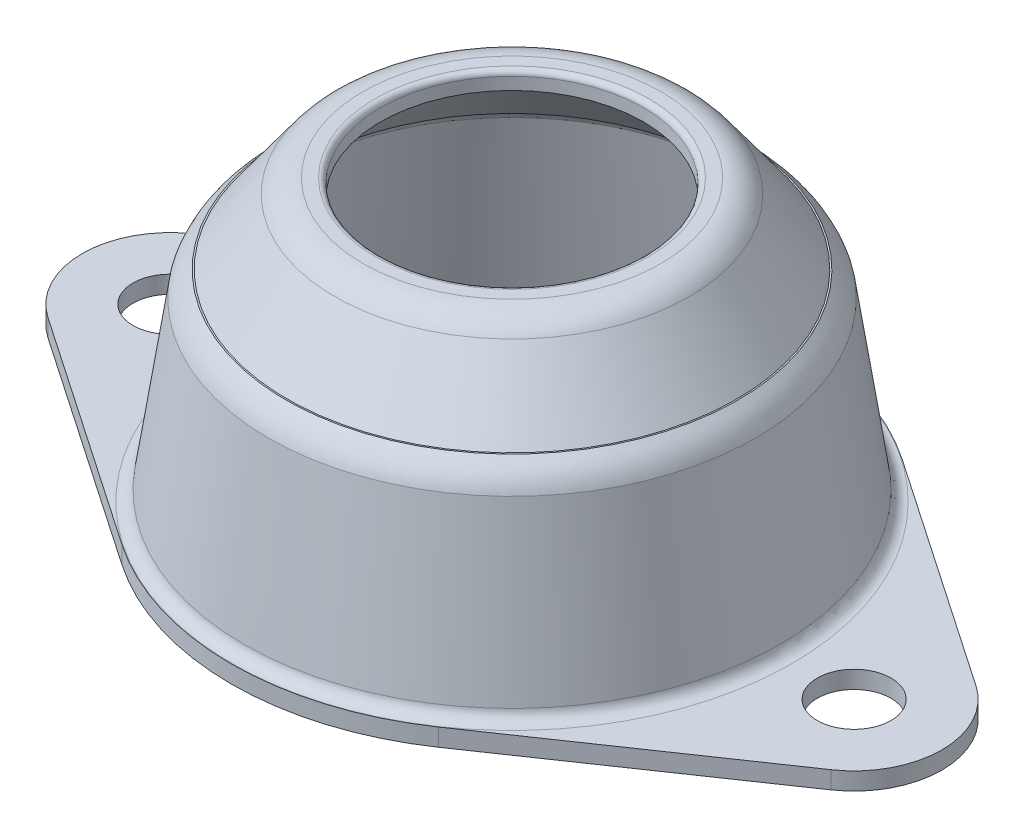
ISO-10303-21;
HEADER;
FILE_DESCRIPTION(('STEP AP214'),'2;1');
FILE_NAME('part.step','',(''),(''),'','','');
FILE_SCHEMA(('AUTOMOTIVE_DESIGN { 1 0 10303 214 1 1 1 1 }'));
ENDSEC;
DATA;
#1=APPLICATION_CONTEXT('core data for automotive mechanical design processes');
#2=APPLICATION_PROTOCOL_DEFINITION('international standard','automotive_design',2000,#1);
#3=PRODUCT_CONTEXT('',#1,'mechanical');
#4=PRODUCT('Part','Part','',(#3));
#5=PRODUCT_RELATED_PRODUCT_CATEGORY('part','',(#4));
#6=PRODUCT_DEFINITION_FORMATION('','',#4);
#7=PRODUCT_DEFINITION_CONTEXT('part definition',#1,'design');
#8=PRODUCT_DEFINITION('design','',#6,#7);
#9=PRODUCT_DEFINITION_SHAPE('','',#8);
#10=(LENGTH_UNIT() NAMED_UNIT(*) SI_UNIT(.MILLI.,.METRE.));
#11=(NAMED_UNIT(*) PLANE_ANGLE_UNIT() SI_UNIT($,.RADIAN.));
#12=(NAMED_UNIT(*) SI_UNIT($,.STERADIAN.) SOLID_ANGLE_UNIT());
#13=UNCERTAINTY_MEASURE_WITH_UNIT(LENGTH_MEASURE(1.E-05),#10,'distance_accuracy_value','');
#14=(GEOMETRIC_REPRESENTATION_CONTEXT(3) GLOBAL_UNCERTAINTY_ASSIGNED_CONTEXT((#13)) GLOBAL_UNIT_ASSIGNED_CONTEXT((#10,
#11,#12)) REPRESENTATION_CONTEXT('',''));
#15=CARTESIAN_POINT('',(0.,0.,0.));
#16=DIRECTION('',(0.,0.,1.));
#17=DIRECTION('',(1.,0.,0.));
#18=AXIS2_PLACEMENT_3D('',#15,#16,#17);
#19=CARTESIAN_POINT('',(0.,0.14593566112625,0.));
#20=DIRECTION('',(0.,-1.,0.));
#21=DIRECTION('',(0.,0.,-1.));
#22=AXIS2_PLACEMENT_3D('',#19,#20,#21);
#23=CONICAL_SURFACE('',#22,15.4892940830772,0.146458693317037);
#24=CARTESIAN_POINT('',(0.,1.59784503721162,0.));
#25=DIRECTION('',(0.,1.,0.));
#26=DIRECTION('',(0.,0.,1.));
#27=AXIS2_PLACEMENT_3D('',#24,#25,#26);
#28=CIRCLE('',#27,15.2751157529741);
#29=CARTESIAN_POINT('',(0.,1.59784503721162,15.2751157529741));
#30=VERTEX_POINT('',#29);
#31=EDGE_CURVE('E225',#30,#30,#28,.T.);
#32=ORIENTED_EDGE('',*,*,#31,.T.);
#33=EDGE_LOOP('',(#32));
#34=FACE_BOUND('',#33,.T.);
#35=CARTESIAN_POINT('',(0.,11.0779504998447,0.));
#36=DIRECTION('',(0.,-1.,0.));
#37=DIRECTION('',(0.,0.,-1.));
#38=AXIS2_PLACEMENT_3D('',#35,#36,#37);
#39=CIRCLE('',#38,13.8766585278661);
#40=CARTESIAN_POINT('',(0.,11.0779504998447,-13.8766585278661));
#41=VERTEX_POINT('',#40);
#42=EDGE_CURVE('E228',#41,#41,#39,.T.);
#43=ORIENTED_EDGE('',*,*,#42,.T.);
#44=EDGE_LOOP('',(#43));
#45=FACE_BOUND('',#44,.T.);
#46=ADVANCED_FACE('F32',(#34,#45),#23,.T.);
#47=CARTESIAN_POINT('',(-8.49127090501881,16.,0.));
#48=DIRECTION('',(0.,1.,0.));
#49=DIRECTION('',(0.,0.,1.));
#50=AXIS2_PLACEMENT_3D('',#47,#48,#49);
#51=PLANE('',#50);
#52=CARTESIAN_POINT('',(0.,16.,0.));
#53=DIRECTION('',(0.,-1.,0.));
#54=DIRECTION('',(0.,0.,-1.));
#55=AXIS2_PLACEMENT_3D('',#52,#53,#54);
#56=CIRCLE('',#55,7.5);
#57=CARTESIAN_POINT('',(0.,16.,-7.5));
#58=VERTEX_POINT('',#57);
#59=EDGE_CURVE('E249',#58,#58,#56,.T.);
#60=ORIENTED_EDGE('',*,*,#59,.F.);
#61=EDGE_LOOP('',(#60));
#62=FACE_BOUND('',#61,.T.);
#63=CARTESIAN_POINT('',(0.,16.,0.));
#64=DIRECTION('',(0.,-1.,0.));
#65=DIRECTION('',(0.,0.,-1.));
#66=AXIS2_PLACEMENT_3D('',#63,#64,#65);
#67=CIRCLE('',#66,8.49127090501881);
#68=CARTESIAN_POINT('',(0.,16.,-8.49127090501881));
#69=VERTEX_POINT('',#68);
#70=EDGE_CURVE('E161',#69,#69,#67,.T.);
#71=ORIENTED_EDGE('',*,*,#70,.T.);
#72=EDGE_LOOP('',(#71));
#73=FACE_BOUND('',#72,.T.);
#74=ADVANCED_FACE('F200',(#62,#73),#51,.F.);
#75=CARTESIAN_POINT('',(0.,-5.41125541125541,0.));
#76=DIRECTION('',(0.,-1.,0.));
#77=DIRECTION('',(0.,0.,-1.));
#78=AXIS2_PLACEMENT_3D('',#75,#76,#77);
#79=CYLINDRICAL_SURFACE('',#78,7.5);
#80=CARTESIAN_POINT('',(0.,16.7,0.));
#81=DIRECTION('',(0.,1.,0.));
#82=DIRECTION('',(0.,0.,1.));
#83=AXIS2_PLACEMENT_3D('',#80,#81,#82);
#84=CIRCLE('',#83,7.5);
#85=CARTESIAN_POINT('',(0.,16.7,7.5));
#86=VERTEX_POINT('',#85);
#87=EDGE_CURVE('E11',#86,#86,#84,.T.);
#88=ORIENTED_EDGE('',*,*,#87,.T.);
#89=EDGE_LOOP('',(#88));
#90=FACE_BOUND('',#89,.T.);
#91=ORIENTED_EDGE('',*,*,#59,.T.);
#92=EDGE_LOOP('',(#91));
#93=FACE_BOUND('',#92,.T.);
#94=ADVANCED_FACE('F196',(#90,#93),#79,.F.);
#95=CARTESIAN_POINT('',(-8.4912709050188,17.,0.));
#96=DIRECTION('',(0.,1.,0.));
#97=DIRECTION('',(0.,0.,1.));
#98=AXIS2_PLACEMENT_3D('',#95,#96,#97);
#99=PLANE('',#98);
#100=CARTESIAN_POINT('',(0.,17.,0.));
#101=DIRECTION('',(0.,1.,0.));
#102=DIRECTION('',(0.,0.,1.));
#103=AXIS2_PLACEMENT_3D('',#100,#101,#102);
#104=CIRCLE('',#103,7.8);
#105=CARTESIAN_POINT('',(0.,17.,7.8));
#106=VERTEX_POINT('',#105);
#107=EDGE_CURVE('E41',#106,#106,#104,.F.);
#108=ORIENTED_EDGE('',*,*,#107,.T.);
#109=EDGE_LOOP('',(#108));
#110=FACE_BOUND('',#109,.T.);
#111=CARTESIAN_POINT('',(0.,17.,0.));
#112=DIRECTION('',(0.,-1.,0.));
#113=DIRECTION('',(0.,0.,-1.));
#114=AXIS2_PLACEMENT_3D('',#111,#112,#113);
#115=CIRCLE('',#114,8.4912709050188);
#116=CARTESIAN_POINT('',(0.,17.,-8.4912709050188));
#117=VERTEX_POINT('',#116);
#118=EDGE_CURVE('E246',#117,#117,#115,.T.);
#119=ORIENTED_EDGE('',*,*,#118,.F.);
#120=EDGE_LOOP('',(#119));
#121=FACE_BOUND('',#120,.T.);
#122=ADVANCED_FACE('F192',(#110,#121),#99,.T.);
#123=CARTESIAN_POINT('',(0.,15.,0.));
#124=DIRECTION('',(0.,-1.,0.));
#125=DIRECTION('',(0.,0.,-1.));
#126=AXIS2_PLACEMENT_3D('',#123,#124,#125);
#127=TOROIDAL_SURFACE('',#126,8.49127090501881,2.);
#128=ORIENTED_EDGE('',*,*,#118,.T.);
#129=EDGE_LOOP('',(#128));
#130=FACE_BOUND('',#129,.T.);
#131=CARTESIAN_POINT('',(0.,16.1776161294884,0.));
#132=DIRECTION('',(0.,-1.,0.));
#133=DIRECTION('',(0.,0.,-1.));
#134=AXIS2_PLACEMENT_3D('',#131,#132,#133);
#135=CIRCLE('',#134,10.1078166827711);
#136=CARTESIAN_POINT('',(0.,16.1776161294884,-10.1078166827711));
#137=VERTEX_POINT('',#136);
#138=EDGE_CURVE('E243',#137,#137,#135,.T.);
#139=ORIENTED_EDGE('',*,*,#138,.F.);
#140=EDGE_LOOP('',(#139));
#141=FACE_BOUND('',#140,.T.);
#142=ADVANCED_FACE('F188',(#130,#141),#127,.T.);
#143=CARTESIAN_POINT('',(0.,12.47,0.));
#144=DIRECTION('',(0.,-1.,0.));
#145=DIRECTION('',(0.,0.,-1.));
#146=AXIS2_PLACEMENT_3D('',#143,#144,#145);
#147=CONICAL_SURFACE('',#146,12.8087290949812,0.629583377949077);
#148=ORIENTED_EDGE('',*,*,#138,.T.);
#149=EDGE_LOOP('',(#148));
#150=FACE_BOUND('',#149,.T.);
#151=CARTESIAN_POINT('',(0.,12.47,0.));
#152=DIRECTION('',(0.,-1.,0.));
#153=DIRECTION('',(0.,0.,-1.));
#154=AXIS2_PLACEMENT_3D('',#151,#152,#153);
#155=CIRCLE('',#154,12.8087290949812);
#156=CARTESIAN_POINT('',(0.,12.47,-12.8087290949812));
#157=VERTEX_POINT('',#156);
#158=EDGE_CURVE('E234',#157,#157,#155,.T.);
#159=ORIENTED_EDGE('',*,*,#158,.F.);
#160=EDGE_LOOP('',(#159));
#161=FACE_BOUND('',#160,.T.);
#162=ADVANCED_FACE('F184',(#150,#161),#147,.T.);
#163=CARTESIAN_POINT('',(-12.5,12.47,0.));
#164=DIRECTION('',(0.,1.,0.));
#165=DIRECTION('',(0.,0.,1.));
#166=AXIS2_PLACEMENT_3D('',#163,#164,#165);
#167=PLANE('',#166);
#168=ORIENTED_EDGE('',*,*,#158,.T.);
#169=EDGE_LOOP('',(#168));
#170=FACE_BOUND('',#169,.T.);
#171=CARTESIAN_POINT('',(0.,12.47,0.));
#172=DIRECTION('',(0.,-1.,0.));
#173=DIRECTION('',(0.,0.,-1.));
#174=AXIS2_PLACEMENT_3D('',#171,#172,#173);
#175=CIRCLE('',#174,12.8924283725623);
#176=CARTESIAN_POINT('',(0.,12.47,-12.8924283725623));
#177=VERTEX_POINT('',#176);
#178=EDGE_CURVE('E230',#177,#177,#175,.T.);
#179=ORIENTED_EDGE('',*,*,#178,.F.);
#180=EDGE_LOOP('',(#179));
#181=FACE_BOUND('',#180,.T.);
#182=ADVANCED_FACE('F179',(#170,#181),#167,.T.);
#183=CARTESIAN_POINT('',(-13.8766585278661,11.0779504998447,0.));
#184=CARTESIAN_POINT('',(-13.8684967377164,11.1026461427083,0.));
#185=CARTESIAN_POINT('',(-13.8603349475667,11.1273417855718,0.));
#186=CARTESIAN_POINT('',(-13.8480922623422,11.1643852498671,0.));
#187=CARTESIAN_POINT('',(-13.8405189963422,11.1870821403624,0.));
#188=CARTESIAN_POINT('',(-13.8264743403839,11.2269960212034,0.));
#189=CARTESIAN_POINT('',(-13.8192024627871,11.2468765407362,0.));
#190=CARTESIAN_POINT('',(-13.7815901074217,11.3458590509594,0.));
#191=CARTESIAN_POINT('',(-13.7474773629329,11.4237043782479,0.));
#192=CARTESIAN_POINT('',(-13.6331780565427,11.6516453264457,0.));
#193=CARTESIAN_POINT('',(-13.5408733173453,11.7960407049975,0.));
#194=CARTESIAN_POINT('',(-13.3817567276208,11.9954908263548,0.));
#195=CARTESIAN_POINT('',(-13.3253174243539,12.0591372425272,0.));
#196=CARTESIAN_POINT('',(-13.2510890906381,12.1347946083073,0.));
#197=CARTESIAN_POINT('',(-13.2285449864589,12.1572005303232,0.));
#198=CARTESIAN_POINT('',(-13.2056041812474,12.179163391162,0.));
#199=CARTESIAN_POINT('',(-13.1902240075664,12.1937063195703,0.));
#200=CARTESIAN_POINT('',(-13.1815604493205,12.2017644585382,0.));
#201=CARTESIAN_POINT('',(-13.1578610987666,12.2237509783301,0.));
#202=CARTESIAN_POINT('',(-13.0630636965507,12.311697057498,0.));
#203=CARTESIAN_POINT('',(-12.968266294335,12.3996431366658,0.));
#204=CARTESIAN_POINT('',(-12.8924283725623,12.47,0.));
#205=B_SPLINE_CURVE_WITH_KNOTS('',3,(#183,#184,#185,#186,#187,#188,#189,#190,#191,#192,#193,
#194,#195,#196,#197,#198,#199,#200,#201,#202,#203,#204),.UNSPECIFIED.,.F.,.F.,(4,2,2,2,2,2,2,1,
2,2,1,4),(0.,0.0624999999999958,0.0937499999999931,0.12499999999999,0.24999999999998,
0.49999999999996,0.624999999999951,0.656249999999949,0.671874999999948,0.687499999999948,
0.749999999999959,1.),.UNSPECIFIED.);
#206=CARTESIAN_POINT('',(0.,-5.41125541125541,0.));
#207=DIRECTION('',(0.,-1.,0.));
#208=AXIS1_PLACEMENT('',#206,#207);
#209=SURFACE_OF_REVOLUTION('',#205,#208);
#210=ORIENTED_EDGE('',*,*,#178,.T.);
#211=EDGE_LOOP('',(#210));
#212=FACE_BOUND('',#211,.T.);
#213=ORIENTED_EDGE('',*,*,#42,.F.);
#214=EDGE_LOOP('',(#213));
#215=FACE_BOUND('',#214,.T.);
#216=ADVANCED_FACE('F174',(#212,#215),#209,.F.);
#217=CARTESIAN_POINT('',(0.,0.,0.));
#218=DIRECTION('',(0.,-1.,0.));
#219=DIRECTION('',(0.,0.,-1.));
#220=AXIS2_PLACEMENT_3D('',#217,#218,#219);
#221=CONICAL_SURFACE('',#220,14.5,0.146458693317037);
#222=CARTESIAN_POINT('',(0.,10.8463587358147,0.));
#223=DIRECTION('',(0.,-1.,0.));
#224=DIRECTION('',(0.,0.,-1.));
#225=AXIS2_PLACEMENT_3D('',#222,#223,#224);
#226=CIRCLE('',#225,12.9);
#227=CARTESIAN_POINT('',(0.,10.8463587358147,-12.9));
#228=VERTEX_POINT('',#227);
#229=EDGE_CURVE('E231',#228,#228,#226,.T.);
#230=ORIENTED_EDGE('',*,*,#229,.F.);
#231=EDGE_LOOP('',(#230));
#232=FACE_BOUND('',#231,.T.);
#233=CARTESIAN_POINT('',(0.,0.,0.));
#234=DIRECTION('',(0.,1.,0.));
#235=DIRECTION('',(0.,0.,1.));
#236=AXIS2_PLACEMENT_3D('',#233,#234,#235);
#237=CIRCLE('',#236,14.5);
#238=CARTESIAN_POINT('',(0.,0.,14.5));
#239=VERTEX_POINT('',#238);
#240=EDGE_CURVE('E326',#239,#239,#237,.T.);
#241=ORIENTED_EDGE('',*,*,#240,.F.);
#242=EDGE_LOOP('',(#241));
#243=FACE_BOUND('',#242,.T.);
#244=ADVANCED_FACE('F178',(#232,#243),#221,.F.);
#245=CARTESIAN_POINT('',(-12.9,10.8463587358147,0.));
#246=CARTESIAN_POINT('',(-12.7796252539608,11.2105841916831,0.));
#247=CARTESIAN_POINT('',(-12.5,11.47,0.));
#248=B_SPLINE_CURVE_WITH_KNOTS('',2,(#245,#246,#247),.UNSPECIFIED.,.F.,.F.,(3,3),(0.,1.),.UNSPECIFIED.);
#249=CARTESIAN_POINT('',(0.,-5.41125541125541,0.));
#250=DIRECTION('',(0.,-1.,0.));
#251=AXIS1_PLACEMENT('',#249,#250);
#252=SURFACE_OF_REVOLUTION('',#248,#251);
#253=CARTESIAN_POINT('',(0.,11.47,0.));
#254=DIRECTION('',(0.,-1.,0.));
#255=DIRECTION('',(0.,0.,-1.));
#256=AXIS2_PLACEMENT_3D('',#253,#254,#255);
#257=CIRCLE('',#256,12.5);
#258=CARTESIAN_POINT('',(0.,11.47,-12.5));
#259=VERTEX_POINT('',#258);
#260=EDGE_CURVE('E237',#259,#259,#257,.T.);
#261=ORIENTED_EDGE('',*,*,#260,.F.);
#262=EDGE_LOOP('',(#261));
#263=FACE_BOUND('',#262,.T.);
#264=ORIENTED_EDGE('',*,*,#229,.T.);
#265=EDGE_LOOP('',(#264));
#266=FACE_BOUND('',#265,.T.);
#267=ADVANCED_FACE('F314',(#263,#266),#252,.T.);
#268=CARTESIAN_POINT('',(-12.5,11.47,0.));
#269=DIRECTION('',(0.,1.,0.));
#270=DIRECTION('',(0.,0.,1.));
#271=AXIS2_PLACEMENT_3D('',#268,#269,#270);
#272=PLANE('',#271);
#273=CARTESIAN_POINT('',(0.,11.47,0.));
#274=DIRECTION('',(0.,-1.,0.));
#275=DIRECTION('',(0.,0.,-1.));
#276=AXIS2_PLACEMENT_3D('',#273,#274,#275);
#277=CIRCLE('',#276,12.3);
#278=CARTESIAN_POINT('',(0.,11.47,-12.3));
#279=VERTEX_POINT('',#278);
#280=EDGE_CURVE('E525',#279,#279,#277,.T.);
#281=ORIENTED_EDGE('',*,*,#280,.F.);
#282=EDGE_LOOP('',(#281));
#283=FACE_BOUND('',#282,.T.);
#284=ORIENTED_EDGE('',*,*,#260,.T.);
#285=EDGE_LOOP('',(#284));
#286=FACE_BOUND('',#285,.T.);
#287=ADVANCED_FACE('F310',(#283,#286),#272,.F.);
#288=CARTESIAN_POINT('',(0.,11.47,0.));
#289=DIRECTION('',(0.,-1.,0.));
#290=DIRECTION('',(0.,0.,-1.));
#291=AXIS2_PLACEMENT_3D('',#288,#289,#290);
#292=CONICAL_SURFACE('',#291,12.3,0.629583377949078);
#293=CARTESIAN_POINT('',(0.,15.5888080647442,0.));
#294=DIRECTION('',(0.,-1.,0.));
#295=DIRECTION('',(0.,0.,-1.));
#296=AXIS2_PLACEMENT_3D('',#293,#294,#295);
#297=CIRCLE('',#296,9.29954379389495);
#298=CARTESIAN_POINT('',(0.,15.5888080647442,-9.29954379389495));
#299=VERTEX_POINT('',#298);
#300=EDGE_CURVE('E527',#299,#299,#297,.T.);
#301=ORIENTED_EDGE('',*,*,#300,.F.);
#302=EDGE_LOOP('',(#301));
#303=FACE_BOUND('',#302,.T.);
#304=ORIENTED_EDGE('',*,*,#280,.T.);
#305=EDGE_LOOP('',(#304));
#306=FACE_BOUND('',#305,.T.);
#307=ADVANCED_FACE('F278',(#303,#306),#292,.F.);
#308=CARTESIAN_POINT('',(0.,15.,0.));
#309=DIRECTION('',(0.,-1.,0.));
#310=DIRECTION('',(0.,0.,-1.));
#311=AXIS2_PLACEMENT_3D('',#308,#309,#310);
#312=TOROIDAL_SURFACE('',#311,8.49127090501881,1.);
#313=ORIENTED_EDGE('',*,*,#70,.F.);
#314=EDGE_LOOP('',(#313));
#315=FACE_BOUND('',#314,.T.);
#316=ORIENTED_EDGE('',*,*,#300,.T.);
#317=EDGE_LOOP('',(#316));
#318=FACE_BOUND('',#317,.T.);
#319=ADVANCED_FACE('F269',(#315,#318),#312,.F.);
#320=CARTESIAN_POINT('',(19.5,1.,0.));
#321=DIRECTION('',(0.,-1.,0.));
#322=DIRECTION('',(0.,0.,-1.));
#323=AXIS2_PLACEMENT_3D('',#320,#321,#322);
#324=PLANE('',#323);
#325=CARTESIAN_POINT('',(0.,1.,0.));
#326=DIRECTION('',(0.,-1.,0.));
#327=DIRECTION('',(0.,0.,-1.));
#328=AXIS2_PLACEMENT_3D('',#325,#326,#327);
#329=CIRCLE('',#328,15.9676216111282);
#330=CARTESIAN_POINT('',(0.,1.,-15.9676216111282));
#331=VERTEX_POINT('',#330);
#332=EDGE_CURVE('E253',#331,#331,#329,.T.);
#333=ORIENTED_EDGE('',*,*,#332,.T.);
#334=EDGE_LOOP('',(#333));
#335=FACE_BOUND('',#334,.T.);
#336=CARTESIAN_POINT('',(19.5,1.,0.));
#337=DIRECTION('',(0.,1.,0.));
#338=DIRECTION('',(0.,0.,-1.));
#339=AXIS2_PLACEMENT_3D('',#336,#337,#338);
#340=CIRCLE('',#339,5.);
#341=CARTESIAN_POINT('',(22.3205128205128,1.,4.12852363797554));
#342=VERTEX_POINT('',#341);
#343=CARTESIAN_POINT('',(22.3205128205128,1.,-4.12852363797554));
#344=VERTEX_POINT('',#343);
#345=EDGE_CURVE('E146',#342,#344,#340,.T.);
#346=ORIENTED_EDGE('',*,*,#345,.T.);
#347=DIRECTION('',(-0.825704727595109,0.,-0.564102564102564));
#348=VECTOR('',#347,1.);
#349=CARTESIAN_POINT('',(22.3205128205128,1.,-4.12852363797554));
#350=LINE('',#349,#348);
#351=CARTESIAN_POINT('',(9.02564102564103,1.,-13.2112756415217));
#352=VERTEX_POINT('',#351);
#353=EDGE_CURVE('E93',#344,#352,#350,.T.);
#354=ORIENTED_EDGE('',*,*,#353,.T.);
#355=CARTESIAN_POINT('',(0.,1.,0.));
#356=DIRECTION('',(0.,1.,0.));
#357=DIRECTION('',(0.,0.,1.));
#358=AXIS2_PLACEMENT_3D('',#355,#356,#357);
#359=CIRCLE('',#358,16.);
#360=CARTESIAN_POINT('',(-9.02564102564102,1.,-13.2112756415217));
#361=VERTEX_POINT('',#360);
#362=EDGE_CURVE('E343',#352,#361,#359,.T.);
#363=ORIENTED_EDGE('',*,*,#362,.T.);
#364=DIRECTION('',(-0.825704727595109,0.,0.564102564102564));
#365=VECTOR('',#364,1.);
#366=CARTESIAN_POINT('',(-22.3205128205128,1.,-4.12852363797554));
#367=LINE('',#366,#365);
#368=CARTESIAN_POINT('',(-22.3205128205128,1.,-4.12852363797554));
#369=VERTEX_POINT('',#368);
#370=EDGE_CURVE('E345',#361,#369,#367,.T.);
#371=ORIENTED_EDGE('',*,*,#370,.T.);
#372=CARTESIAN_POINT('',(-19.5,1.,0.));
#373=DIRECTION('',(0.,1.,0.));
#374=DIRECTION('',(0.,0.,1.));
#375=AXIS2_PLACEMENT_3D('',#372,#373,#374);
#376=CIRCLE('',#375,5.);
#377=CARTESIAN_POINT('',(-22.3205128205128,1.,4.12852363797554));
#378=VERTEX_POINT('',#377);
#379=EDGE_CURVE('E113',#369,#378,#376,.T.);
#380=ORIENTED_EDGE('',*,*,#379,.T.);
#381=DIRECTION('',(0.825704727595109,0.,0.564102564102564));
#382=VECTOR('',#381,1.);
#383=CARTESIAN_POINT('',(-22.3205128205128,1.,4.12852363797554));
#384=LINE('',#383,#382);
#385=CARTESIAN_POINT('',(-9.02564102564102,1.,13.2112756415217));
#386=VERTEX_POINT('',#385);
#387=EDGE_CURVE('E106',#378,#386,#384,.T.);
#388=ORIENTED_EDGE('',*,*,#387,.T.);
#389=CARTESIAN_POINT('',(0.,1.,0.));
#390=DIRECTION('',(0.,1.,0.));
#391=DIRECTION('',(0.,0.,-1.));
#392=AXIS2_PLACEMENT_3D('',#389,#390,#391);
#393=CIRCLE('',#392,16.);
#394=CARTESIAN_POINT('',(9.02564102564102,1.,13.2112756415217));
#395=VERTEX_POINT('',#394);
#396=EDGE_CURVE('E111',#386,#395,#393,.T.);
#397=ORIENTED_EDGE('',*,*,#396,.T.);
#398=DIRECTION('',(0.825704727595109,0.,-0.564102564102564));
#399=VECTOR('',#398,1.);
#400=CARTESIAN_POINT('',(22.3205128205128,1.,4.12852363797554));
#401=LINE('',#400,#399);
#402=EDGE_CURVE('E49',#395,#342,#401,.T.);
#403=ORIENTED_EDGE('',*,*,#402,.T.);
#404=EDGE_LOOP('',(#346,#354,#363,#371,#380,#388,#397,#403));
#405=FACE_BOUND('',#404,.T.);
#406=CARTESIAN_POINT('',(-19.5,1.,0.));
#407=DIRECTION('',(0.,1.,0.));
#408=DIRECTION('',(0.,0.,1.));
#409=AXIS2_PLACEMENT_3D('',#406,#407,#408);
#410=CIRCLE('',#409,2.1);
#411=CARTESIAN_POINT('',(-19.5,1.,2.1));
#412=VERTEX_POINT('',#411);
#413=EDGE_CURVE('E135',#412,#412,#410,.T.);
#414=ORIENTED_EDGE('',*,*,#413,.F.);
#415=EDGE_LOOP('',(#414));
#416=FACE_BOUND('',#415,.T.);
#417=CARTESIAN_POINT('',(19.5,1.,0.));
#418=DIRECTION('',(0.,1.,0.));
#419=DIRECTION('',(0.,0.,-1.));
#420=AXIS2_PLACEMENT_3D('',#417,#418,#419);
#421=CIRCLE('',#420,2.1);
#422=CARTESIAN_POINT('',(19.5,1.,-2.1));
#423=VERTEX_POINT('',#422);
#424=EDGE_CURVE('E331',#423,#423,#421,.T.);
#425=ORIENTED_EDGE('',*,*,#424,.F.);
#426=EDGE_LOOP('',(#425));
#427=FACE_BOUND('',#426,.T.);
#428=ADVANCED_FACE('F108',(#335,#405,#416,#427),#324,.F.);
#429=CARTESIAN_POINT('',(19.5,0.,0.));
#430=DIRECTION('',(0.,-1.,0.));
#431=DIRECTION('',(0.,0.,-1.));
#432=AXIS2_PLACEMENT_3D('',#429,#430,#431);
#433=PLANE('',#432);
#434=CARTESIAN_POINT('',(19.5,0.,0.));
#435=DIRECTION('',(0.,1.,0.));
#436=DIRECTION('',(0.,0.,-1.));
#437=AXIS2_PLACEMENT_3D('',#434,#435,#436);
#438=CIRCLE('',#437,2.1);
#439=CARTESIAN_POINT('',(19.5,0.,-2.1));
#440=VERTEX_POINT('',#439);
#441=EDGE_CURVE('E328',#440,#440,#438,.T.);
#442=ORIENTED_EDGE('',*,*,#441,.T.);
#443=EDGE_LOOP('',(#442));
#444=FACE_BOUND('',#443,.T.);
#445=CARTESIAN_POINT('',(19.5,0.,0.));
#446=DIRECTION('',(0.,1.,0.));
#447=DIRECTION('',(0.,0.,-1.));
#448=AXIS2_PLACEMENT_3D('',#445,#446,#447);
#449=CIRCLE('',#448,5.);
#450=CARTESIAN_POINT('',(22.3205128205128,0.,4.12852363797554));
#451=VERTEX_POINT('',#450);
#452=CARTESIAN_POINT('',(22.3205128205128,0.,-4.12852363797554));
#453=VERTEX_POINT('',#452);
#454=EDGE_CURVE('E131',#451,#453,#449,.T.);
#455=ORIENTED_EDGE('',*,*,#454,.F.);
#456=DIRECTION('',(0.825704727595109,0.,-0.564102564102564));
#457=VECTOR('',#456,1.);
#458=CARTESIAN_POINT('',(22.3205128205128,0.,4.12852363797554));
#459=LINE('',#458,#457);
#460=CARTESIAN_POINT('',(9.02564102564102,0.,13.2112756415217));
#461=VERTEX_POINT('',#460);
#462=EDGE_CURVE('E84',#461,#451,#459,.T.);
#463=ORIENTED_EDGE('',*,*,#462,.F.);
#464=CARTESIAN_POINT('',(0.,0.,0.));
#465=DIRECTION('',(0.,1.,0.));
#466=DIRECTION('',(0.,0.,-1.));
#467=AXIS2_PLACEMENT_3D('',#464,#465,#466);
#468=CIRCLE('',#467,16.);
#469=CARTESIAN_POINT('',(-9.02564102564102,0.,13.2112756415217));
#470=VERTEX_POINT('',#469);
#471=EDGE_CURVE('E78',#470,#461,#468,.T.);
#472=ORIENTED_EDGE('',*,*,#471,.F.);
#473=DIRECTION('',(0.825704727595109,0.,0.564102564102564));
#474=VECTOR('',#473,1.);
#475=CARTESIAN_POINT('',(-22.3205128205128,0.,4.12852363797554));
#476=LINE('',#475,#474);
#477=CARTESIAN_POINT('',(-22.3205128205128,0.,4.12852363797554));
#478=VERTEX_POINT('',#477);
#479=EDGE_CURVE('E121',#478,#470,#476,.T.);
#480=ORIENTED_EDGE('',*,*,#479,.F.);
#481=CARTESIAN_POINT('',(-19.5,0.,0.));
#482=DIRECTION('',(0.,1.,0.));
#483=DIRECTION('',(0.,0.,1.));
#484=AXIS2_PLACEMENT_3D('',#481,#482,#483);
#485=CIRCLE('',#484,5.);
#486=CARTESIAN_POINT('',(-22.3205128205128,0.,-4.12852363797554));
#487=VERTEX_POINT('',#486);
#488=EDGE_CURVE('E141',#487,#478,#485,.T.);
#489=ORIENTED_EDGE('',*,*,#488,.F.);
#490=DIRECTION('',(-0.825704727595109,0.,0.564102564102564));
#491=VECTOR('',#490,1.);
#492=CARTESIAN_POINT('',(-22.3205128205128,0.,-4.12852363797554));
#493=LINE('',#492,#491);
#494=CARTESIAN_POINT('',(-9.02564102564102,0.,-13.2112756415217));
#495=VERTEX_POINT('',#494);
#496=EDGE_CURVE('E139',#495,#487,#493,.T.);
#497=ORIENTED_EDGE('',*,*,#496,.F.);
#498=CARTESIAN_POINT('',(0.,0.,0.));
#499=DIRECTION('',(0.,1.,0.));
#500=DIRECTION('',(0.,0.,1.));
#501=AXIS2_PLACEMENT_3D('',#498,#499,#500);
#502=CIRCLE('',#501,16.);
#503=CARTESIAN_POINT('',(9.02564102564103,0.,-13.2112756415217));
#504=VERTEX_POINT('',#503);
#505=EDGE_CURVE('E137',#504,#495,#502,.T.);
#506=ORIENTED_EDGE('',*,*,#505,.F.);
#507=DIRECTION('',(-0.825704727595109,0.,-0.564102564102564));
#508=VECTOR('',#507,1.);
#509=CARTESIAN_POINT('',(22.3205128205128,0.,-4.12852363797554));
#510=LINE('',#509,#508);
#511=EDGE_CURVE('E134',#453,#504,#510,.T.);
#512=ORIENTED_EDGE('',*,*,#511,.F.);
#513=EDGE_LOOP('',(#455,#463,#472,#480,#489,#497,#506,#512));
#514=FACE_BOUND('',#513,.T.);
#515=CARTESIAN_POINT('',(-19.5,0.,0.));
#516=DIRECTION('',(0.,1.,0.));
#517=DIRECTION('',(0.,0.,1.));
#518=AXIS2_PLACEMENT_3D('',#515,#516,#517);
#519=CIRCLE('',#518,2.1);
#520=CARTESIAN_POINT('',(-19.5,0.,2.1));
#521=VERTEX_POINT('',#520);
#522=EDGE_CURVE('E335',#521,#521,#519,.T.);
#523=ORIENTED_EDGE('',*,*,#522,.T.);
#524=EDGE_LOOP('',(#523));
#525=FACE_BOUND('',#524,.T.);
#526=ORIENTED_EDGE('',*,*,#240,.T.);
#527=EDGE_LOOP('',(#526));
#528=FACE_BOUND('',#527,.T.);
#529=ADVANCED_FACE('F268',(#444,#514,#525,#528),#433,.T.);
#530=CARTESIAN_POINT('',(19.5,1.,0.));
#531=DIRECTION('',(0.,-1.,0.));
#532=DIRECTION('',(0.,0.,-1.));
#533=AXIS2_PLACEMENT_3D('',#530,#531,#532);
#534=CYLINDRICAL_SURFACE('',#533,5.);
#535=ORIENTED_EDGE('',*,*,#454,.T.);
#536=DIRECTION('',(0.,-1.,0.));
#537=VECTOR('',#536,1.);
#538=CARTESIAN_POINT('',(22.3205128205128,1.,-4.12852363797554));
#539=LINE('',#538,#537);
#540=EDGE_CURVE('E159',#344,#453,#539,.T.);
#541=ORIENTED_EDGE('',*,*,#540,.F.);
#542=ORIENTED_EDGE('',*,*,#345,.F.);
#543=DIRECTION('',(0.,-1.,0.));
#544=VECTOR('',#543,1.);
#545=CARTESIAN_POINT('',(22.3205128205128,1.,4.12852363797554));
#546=LINE('',#545,#544);
#547=EDGE_CURVE('E127',#342,#451,#546,.T.);
#548=ORIENTED_EDGE('',*,*,#547,.T.);
#549=EDGE_LOOP('',(#535,#541,#542,#548));
#550=FACE_BOUND('',#549,.T.);
#551=ADVANCED_FACE('F275',(#550),#534,.T.);
#552=CARTESIAN_POINT('',(22.3205128205128,1.,-4.12852363797554));
#553=DIRECTION('',(-0.564102564102564,0.,0.825704727595109));
#554=DIRECTION('',(0.825704727595109,0.,0.564102564102564));
#555=AXIS2_PLACEMENT_3D('',#552,#553,#554);
#556=PLANE('',#555);
#557=ORIENTED_EDGE('',*,*,#511,.T.);
#558=DIRECTION('',(0.,-1.,0.));
#559=VECTOR('',#558,1.);
#560=CARTESIAN_POINT('',(9.02564102564103,1.,-13.2112756415217));
#561=LINE('',#560,#559);
#562=EDGE_CURVE('E156',#352,#504,#561,.T.);
#563=ORIENTED_EDGE('',*,*,#562,.F.);
#564=ORIENTED_EDGE('',*,*,#353,.F.);
#565=ORIENTED_EDGE('',*,*,#540,.T.);
#566=EDGE_LOOP('',(#557,#563,#564,#565));
#567=FACE_BOUND('',#566,.T.);
#568=ADVANCED_FACE('F301',(#567),#556,.F.);
#569=CARTESIAN_POINT('',(0.,1.,0.));
#570=DIRECTION('',(0.,-1.,0.));
#571=DIRECTION('',(0.,0.,-1.));
#572=AXIS2_PLACEMENT_3D('',#569,#570,#571);
#573=CYLINDRICAL_SURFACE('',#572,16.);
#574=ORIENTED_EDGE('',*,*,#505,.T.);
#575=DIRECTION('',(0.,-1.,0.));
#576=VECTOR('',#575,1.);
#577=CARTESIAN_POINT('',(-9.02564102564102,1.,-13.2112756415217));
#578=LINE('',#577,#576);
#579=EDGE_CURVE('E153',#361,#495,#578,.T.);
#580=ORIENTED_EDGE('',*,*,#579,.F.);
#581=ORIENTED_EDGE('',*,*,#362,.F.);
#582=ORIENTED_EDGE('',*,*,#562,.T.);
#583=EDGE_LOOP('',(#574,#580,#581,#582));
#584=FACE_BOUND('',#583,.T.);
#585=ADVANCED_FACE('F297',(#584),#573,.T.);
#586=CARTESIAN_POINT('',(-22.3205128205128,1.,-4.12852363797554));
#587=DIRECTION('',(0.564102564102564,0.,0.825704727595109));
#588=DIRECTION('',(0.825704727595109,0.,-0.564102564102564));
#589=AXIS2_PLACEMENT_3D('',#586,#587,#588);
#590=PLANE('',#589);
#591=ORIENTED_EDGE('',*,*,#496,.T.);
#592=DIRECTION('',(0.,-1.,0.));
#593=VECTOR('',#592,1.);
#594=CARTESIAN_POINT('',(-22.3205128205128,1.,-4.12852363797554));
#595=LINE('',#594,#593);
#596=EDGE_CURVE('E150',#369,#487,#595,.T.);
#597=ORIENTED_EDGE('',*,*,#596,.F.);
#598=ORIENTED_EDGE('',*,*,#370,.F.);
#599=ORIENTED_EDGE('',*,*,#579,.T.);
#600=EDGE_LOOP('',(#591,#597,#598,#599));
#601=FACE_BOUND('',#600,.T.);
#602=ADVANCED_FACE('F293',(#601),#590,.F.);
#603=CARTESIAN_POINT('',(-19.5,1.,0.));
#604=DIRECTION('',(0.,-1.,0.));
#605=DIRECTION('',(0.,0.,-1.));
#606=AXIS2_PLACEMENT_3D('',#603,#604,#605);
#607=CYLINDRICAL_SURFACE('',#606,5.);
#608=ORIENTED_EDGE('',*,*,#488,.T.);
#609=DIRECTION('',(0.,-1.,0.));
#610=VECTOR('',#609,1.);
#611=CARTESIAN_POINT('',(-22.3205128205128,1.,4.12852363797554));
#612=LINE('',#611,#610);
#613=EDGE_CURVE('E122',#378,#478,#612,.T.);
#614=ORIENTED_EDGE('',*,*,#613,.F.);
#615=ORIENTED_EDGE('',*,*,#379,.F.);
#616=ORIENTED_EDGE('',*,*,#596,.T.);
#617=EDGE_LOOP('',(#608,#614,#615,#616));
#618=FACE_BOUND('',#617,.T.);
#619=ADVANCED_FACE('F290',(#618),#607,.T.);
#620=CARTESIAN_POINT('',(-22.3205128205128,1.,4.12852363797554));
#621=DIRECTION('',(0.564102564102564,0.,-0.825704727595109));
#622=DIRECTION('',(-0.825704727595109,0.,-0.564102564102564));
#623=AXIS2_PLACEMENT_3D('',#620,#621,#622);
#624=PLANE('',#623);
#625=ORIENTED_EDGE('',*,*,#479,.T.);
#626=DIRECTION('',(0.,-1.,0.));
#627=VECTOR('',#626,1.);
#628=CARTESIAN_POINT('',(-9.02564102564102,1.,13.2112756415217));
#629=LINE('',#628,#627);
#630=EDGE_CURVE('E118',#386,#470,#629,.T.);
#631=ORIENTED_EDGE('',*,*,#630,.F.);
#632=ORIENTED_EDGE('',*,*,#387,.F.);
#633=ORIENTED_EDGE('',*,*,#613,.T.);
#634=EDGE_LOOP('',(#625,#631,#632,#633));
#635=FACE_BOUND('',#634,.T.);
#636=ADVANCED_FACE('F119',(#635),#624,.F.);
#637=CARTESIAN_POINT('',(0.,1.,0.));
#638=DIRECTION('',(0.,-1.,0.));
#639=DIRECTION('',(0.,0.,-1.));
#640=AXIS2_PLACEMENT_3D('',#637,#638,#639);
#641=CYLINDRICAL_SURFACE('',#640,16.);
#642=ORIENTED_EDGE('',*,*,#471,.T.);
#643=DIRECTION('',(0.,-1.,0.));
#644=VECTOR('',#643,1.);
#645=CARTESIAN_POINT('',(9.02564102564102,1.,13.2112756415217));
#646=LINE('',#645,#644);
#647=EDGE_CURVE('E123',#395,#461,#646,.T.);
#648=ORIENTED_EDGE('',*,*,#647,.F.);
#649=ORIENTED_EDGE('',*,*,#396,.F.);
#650=ORIENTED_EDGE('',*,*,#630,.T.);
#651=EDGE_LOOP('',(#642,#648,#649,#650));
#652=FACE_BOUND('',#651,.T.);
#653=ADVANCED_FACE('F125',(#652),#641,.T.);
#654=CARTESIAN_POINT('',(22.3205128205128,1.,4.12852363797554));
#655=DIRECTION('',(-0.564102564102564,0.,-0.825704727595109));
#656=DIRECTION('',(-0.825704727595109,0.,0.564102564102564));
#657=AXIS2_PLACEMENT_3D('',#654,#655,#656);
#658=PLANE('',#657);
#659=ORIENTED_EDGE('',*,*,#462,.T.);
#660=ORIENTED_EDGE('',*,*,#547,.F.);
#661=ORIENTED_EDGE('',*,*,#402,.F.);
#662=ORIENTED_EDGE('',*,*,#647,.T.);
#663=EDGE_LOOP('',(#659,#660,#661,#662));
#664=FACE_BOUND('',#663,.T.);
#665=ADVANCED_FACE('F283',(#664),#658,.F.);
#666=CARTESIAN_POINT('',(-19.5,1.,0.));
#667=DIRECTION('',(0.,-1.,0.));
#668=DIRECTION('',(0.,0.,-1.));
#669=AXIS2_PLACEMENT_3D('',#666,#667,#668);
#670=CYLINDRICAL_SURFACE('',#669,2.1);
#671=ORIENTED_EDGE('',*,*,#413,.T.);
#672=EDGE_LOOP('',(#671));
#673=FACE_BOUND('',#672,.T.);
#674=ORIENTED_EDGE('',*,*,#522,.F.);
#675=EDGE_LOOP('',(#674));
#676=FACE_BOUND('',#675,.T.);
#677=ADVANCED_FACE('F213',(#673,#676),#670,.F.);
#678=CARTESIAN_POINT('',(19.5,1.,0.));
#679=DIRECTION('',(0.,-1.,0.));
#680=DIRECTION('',(0.,0.,-1.));
#681=AXIS2_PLACEMENT_3D('',#678,#679,#680);
#682=CYLINDRICAL_SURFACE('',#681,2.1);
#683=ORIENTED_EDGE('',*,*,#424,.T.);
#684=EDGE_LOOP('',(#683));
#685=FACE_BOUND('',#684,.T.);
#686=ORIENTED_EDGE('',*,*,#441,.F.);
#687=EDGE_LOOP('',(#686));
#688=FACE_BOUND('',#687,.T.);
#689=ADVANCED_FACE('F206',(#685,#688),#682,.F.);
#690=CARTESIAN_POINT('',(0.,1.7,0.));
#691=DIRECTION('',(0.,-1.,0.));
#692=DIRECTION('',(0.,0.,-1.));
#693=AXIS2_PLACEMENT_3D('',#690,#691,#692);
#694=TOROIDAL_SURFACE('',#693,15.9676216111282,0.7);
#695=ORIENTED_EDGE('',*,*,#332,.F.);
#696=EDGE_LOOP('',(#695));
#697=FACE_BOUND('',#696,.T.);
#698=ORIENTED_EDGE('',*,*,#31,.F.);
#699=EDGE_LOOP('',(#698));
#700=FACE_BOUND('',#699,.T.);
#701=ADVANCED_FACE('F204',(#697,#700),#694,.F.);
#702=CARTESIAN_POINT('',(0.,16.7,0.));
#703=DIRECTION('',(0.,1.,0.));
#704=DIRECTION('',(0.,0.,1.));
#705=AXIS2_PLACEMENT_3D('',#702,#703,#704);
#706=TOROIDAL_SURFACE('',#705,7.8,0.3);
#707=ORIENTED_EDGE('',*,*,#87,.F.);
#708=EDGE_LOOP('',(#707));
#709=FACE_BOUND('',#708,.T.);
#710=ORIENTED_EDGE('',*,*,#107,.F.);
#711=EDGE_LOOP('',(#710));
#712=FACE_BOUND('',#711,.T.);
#713=ADVANCED_FACE('F34',(#709,#712),#706,.T.);
#714=CLOSED_SHELL('',(#46,#74,#94,#122,#142,#162,#182,#216,#244,#267,#287,#307,#319,#428,#529,
#551,#568,#585,#602,#619,#636,#653,#665,#677,#689,#701,#713));
#715=MANIFOLD_SOLID_BREP('B2',#714);
#716=ADVANCED_BREP_SHAPE_REPRESENTATION('',(#18,#715),#14);
#717=SHAPE_DEFINITION_REPRESENTATION(#9,#716);
ENDSEC;
END-ISO-10303-21;
